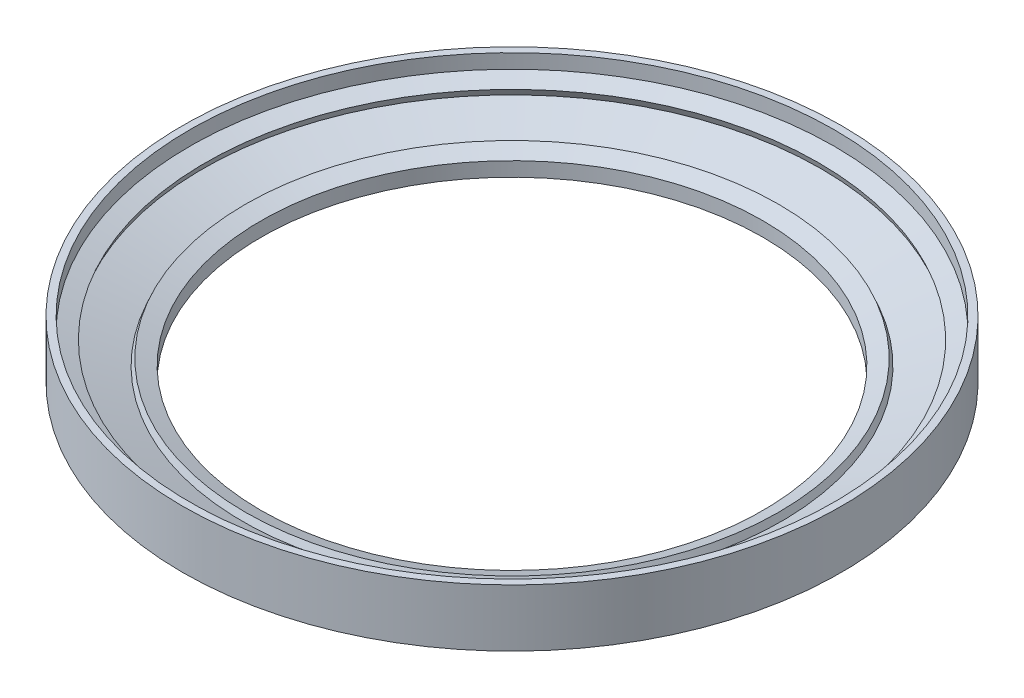
ISO-10303-21;
HEADER;
FILE_DESCRIPTION(('STEP AP214'),'2;1');
FILE_NAME('part.step','',(''),(''),'','','');
FILE_SCHEMA(('AUTOMOTIVE_DESIGN { 1 0 10303 214 1 1 1 1 }'));
ENDSEC;
DATA;
#1=APPLICATION_CONTEXT('core data for automotive mechanical design processes');
#2=APPLICATION_PROTOCOL_DEFINITION('international standard','automotive_design',2000,#1);
#3=PRODUCT_CONTEXT('',#1,'mechanical');
#4=PRODUCT('Part','Part','',(#3));
#5=PRODUCT_RELATED_PRODUCT_CATEGORY('part','',(#4));
#6=PRODUCT_DEFINITION_FORMATION('','',#4);
#7=PRODUCT_DEFINITION_CONTEXT('part definition',#1,'design');
#8=PRODUCT_DEFINITION('design','',#6,#7);
#9=PRODUCT_DEFINITION_SHAPE('','',#8);
#10=(LENGTH_UNIT() NAMED_UNIT(*) SI_UNIT(.MILLI.,.METRE.));
#11=(NAMED_UNIT(*) PLANE_ANGLE_UNIT() SI_UNIT($,.RADIAN.));
#12=(NAMED_UNIT(*) SI_UNIT($,.STERADIAN.) SOLID_ANGLE_UNIT());
#13=UNCERTAINTY_MEASURE_WITH_UNIT(LENGTH_MEASURE(1.E-05),#10,'distance_accuracy_value','');
#14=(GEOMETRIC_REPRESENTATION_CONTEXT(3) GLOBAL_UNCERTAINTY_ASSIGNED_CONTEXT((#13)) GLOBAL_UNIT_ASSIGNED_CONTEXT((#10,
#11,#12)) REPRESENTATION_CONTEXT('',''));
#15=CARTESIAN_POINT('',(0.,0.,0.));
#16=DIRECTION('',(0.,0.,1.));
#17=DIRECTION('',(1.,0.,0.));
#18=AXIS2_PLACEMENT_3D('',#15,#16,#17);
#19=CARTESIAN_POINT('',(-45.9614077649859,0.,0.));
#20=DIRECTION('',(0.,1.,0.));
#21=DIRECTION('',(0.,0.,1.));
#22=AXIS2_PLACEMENT_3D('',#19,#20,#21);
#23=PLANE('',#22);
#24=CARTESIAN_POINT('',(0.,0.,0.));
#25=DIRECTION('',(0.,-1.,0.));
#26=DIRECTION('',(0.,0.,-1.));
#27=AXIS2_PLACEMENT_3D('',#24,#25,#26);
#28=CIRCLE('',#27,35.);
#29=CARTESIAN_POINT('',(0.,0.,-35.));
#30=VERTEX_POINT('',#29);
#31=EDGE_CURVE('E64',#30,#30,#28,.T.);
#32=ORIENTED_EDGE('',*,*,#31,.F.);
#33=EDGE_LOOP('',(#32));
#34=FACE_BOUND('',#33,.T.);
#35=CARTESIAN_POINT('',(0.,0.,0.));
#36=DIRECTION('',(0.,-1.,0.));
#37=DIRECTION('',(0.,0.,-1.));
#38=AXIS2_PLACEMENT_3D('',#35,#36,#37);
#39=CIRCLE('',#38,45.9614077649859);
#40=CARTESIAN_POINT('',(0.,0.,-45.9614077649859));
#41=VERTEX_POINT('',#40);
#42=EDGE_CURVE('E10',#41,#41,#39,.T.);
#43=ORIENTED_EDGE('',*,*,#42,.T.);
#44=EDGE_LOOP('',(#43));
#45=FACE_BOUND('',#44,.T.);
#46=ADVANCED_FACE('F30',(#34,#45),#23,.F.);
#47=CARTESIAN_POINT('',(0.,0.,0.));
#48=DIRECTION('',(0.,-1.,0.));
#49=DIRECTION('',(0.,0.,-1.));
#50=AXIS2_PLACEMENT_3D('',#47,#48,#49);
#51=CYLINDRICAL_SURFACE('',#50,45.9614077649859);
#52=ORIENTED_EDGE('',*,*,#42,.F.);
#53=EDGE_LOOP('',(#52));
#54=FACE_BOUND('',#53,.T.);
#55=CARTESIAN_POINT('',(0.,8.,0.));
#56=DIRECTION('',(0.,-1.,0.));
#57=DIRECTION('',(0.,0.,-1.));
#58=AXIS2_PLACEMENT_3D('',#55,#56,#57);
#59=CIRCLE('',#58,45.9614077649859);
#60=CARTESIAN_POINT('',(0.,8.,-45.9614077649859));
#61=VERTEX_POINT('',#60);
#62=EDGE_CURVE('E36',#61,#61,#59,.T.);
#63=ORIENTED_EDGE('',*,*,#62,.T.);
#64=EDGE_LOOP('',(#63));
#65=FACE_BOUND('',#64,.T.);
#66=ADVANCED_FACE('F71',(#54,#65),#51,.T.);
#67=CARTESIAN_POINT('',(-45.9614077649859,8.,0.));
#68=DIRECTION('',(0.,-1.,0.));
#69=DIRECTION('',(0.,0.,-1.));
#70=AXIS2_PLACEMENT_3D('',#67,#68,#69);
#71=PLANE('',#70);
#72=ORIENTED_EDGE('',*,*,#62,.F.);
#73=EDGE_LOOP('',(#72));
#74=FACE_BOUND('',#73,.T.);
#75=CARTESIAN_POINT('',(0.,8.,0.));
#76=DIRECTION('',(0.,-1.,0.));
#77=DIRECTION('',(0.,0.,-1.));
#78=AXIS2_PLACEMENT_3D('',#75,#76,#77);
#79=CIRCLE('',#78,44.9614077649859);
#80=CARTESIAN_POINT('',(0.,8.,-44.9614077649859));
#81=VERTEX_POINT('',#80);
#82=EDGE_CURVE('E40',#81,#81,#79,.T.);
#83=ORIENTED_EDGE('',*,*,#82,.T.);
#84=EDGE_LOOP('',(#83));
#85=FACE_BOUND('',#84,.T.);
#86=ADVANCED_FACE('F75',(#74,#85),#71,.F.);
#87=CARTESIAN_POINT('',(0.,0.,0.));
#88=DIRECTION('',(0.,-1.,0.));
#89=DIRECTION('',(0.,0.,-1.));
#90=AXIS2_PLACEMENT_3D('',#87,#88,#89);
#91=CYLINDRICAL_SURFACE('',#90,44.9614077649859);
#92=ORIENTED_EDGE('',*,*,#82,.F.);
#93=EDGE_LOOP('',(#92));
#94=FACE_BOUND('',#93,.T.);
#95=CARTESIAN_POINT('',(0.,6.,0.));
#96=DIRECTION('',(0.,-1.,0.));
#97=DIRECTION('',(0.,0.,-1.));
#98=AXIS2_PLACEMENT_3D('',#95,#96,#97);
#99=CIRCLE('',#98,44.9614077649859);
#100=CARTESIAN_POINT('',(0.,6.,-44.9614077649859));
#101=VERTEX_POINT('',#100);
#102=EDGE_CURVE('E44',#101,#101,#99,.T.);
#103=ORIENTED_EDGE('',*,*,#102,.T.);
#104=EDGE_LOOP('',(#103));
#105=FACE_BOUND('',#104,.T.);
#106=ADVANCED_FACE('F80',(#94,#105),#91,.F.);
#107=CARTESIAN_POINT('',(0.,5.11789016347869,0.));
#108=DIRECTION('',(0.,1.,0.));
#109=DIRECTION('',(0.,0.,1.));
#110=AXIS2_PLACEMENT_3D('',#107,#108,#109);
#111=CONICAL_SURFACE('',#110,42.7646438212125,1.18895474162259);
#112=ORIENTED_EDGE('',*,*,#102,.F.);
#113=EDGE_LOOP('',(#112));
#114=FACE_BOUND('',#113,.T.);
#115=CARTESIAN_POINT('',(0.,5.11789016347869,0.));
#116=DIRECTION('',(0.,-1.,0.));
#117=DIRECTION('',(0.,0.,-1.));
#118=AXIS2_PLACEMENT_3D('',#115,#116,#117);
#119=CIRCLE('',#118,42.7646438212125);
#120=CARTESIAN_POINT('',(0.,5.11789016347869,-42.7646438212125));
#121=VERTEX_POINT('',#120);
#122=EDGE_CURVE('E49',#121,#121,#119,.T.);
#123=ORIENTED_EDGE('',*,*,#122,.T.);
#124=EDGE_LOOP('',(#123));
#125=FACE_BOUND('',#124,.T.);
#126=ADVANCED_FACE('F86',(#114,#125),#111,.F.);
#127=CARTESIAN_POINT('',(0.,4.18991018390552,0.));
#128=DIRECTION('',(0.,-1.,0.));
#129=DIRECTION('',(0.,0.,-1.));
#130=AXIS2_PLACEMENT_3D('',#127,#128,#129);
#131=CONICAL_SURFACE('',#130,43.1372738757054,0.38184158517231);
#132=ORIENTED_EDGE('',*,*,#122,.F.);
#133=EDGE_LOOP('',(#132));
#134=FACE_BOUND('',#133,.T.);
#135=CARTESIAN_POINT('',(0.,4.18991018390552,0.));
#136=DIRECTION('',(0.,-1.,0.));
#137=DIRECTION('',(0.,0.,-1.));
#138=AXIS2_PLACEMENT_3D('',#135,#136,#137);
#139=CIRCLE('',#138,43.1372738757054);
#140=CARTESIAN_POINT('',(0.,4.18991018390552,-43.1372738757054));
#141=VERTEX_POINT('',#140);
#142=EDGE_CURVE('E52',#141,#141,#139,.T.);
#143=ORIENTED_EDGE('',*,*,#142,.T.);
#144=EDGE_LOOP('',(#143));
#145=FACE_BOUND('',#144,.T.);
#146=ADVANCED_FACE('F90',(#134,#145),#131,.F.);
#147=CARTESIAN_POINT('',(0.,1.95412985694813,0.));
#148=DIRECTION('',(0.,1.,0.));
#149=DIRECTION('',(0.,0.,1.));
#150=AXIS2_PLACEMENT_3D('',#147,#148,#149);
#151=CONICAL_SURFACE('',#150,37.5693939982663,1.18895474162259);
#152=ORIENTED_EDGE('',*,*,#142,.F.);
#153=EDGE_LOOP('',(#152));
#154=FACE_BOUND('',#153,.T.);
#155=CARTESIAN_POINT('',(0.,1.95412985694813,0.));
#156=DIRECTION('',(0.,-1.,0.));
#157=DIRECTION('',(0.,0.,-1.));
#158=AXIS2_PLACEMENT_3D('',#155,#156,#157);
#159=CIRCLE('',#158,37.5693939982663);
#160=CARTESIAN_POINT('',(0.,1.95412985694813,-37.5693939982663));
#161=VERTEX_POINT('',#160);
#162=EDGE_CURVE('E55',#161,#161,#159,.T.);
#163=ORIENTED_EDGE('',*,*,#162,.T.);
#164=EDGE_LOOP('',(#163));
#165=FACE_BOUND('',#164,.T.);
#166=ADVANCED_FACE('F94',(#154,#165),#151,.F.);
#167=CARTESIAN_POINT('',(0.,2.8821098365213,0.));
#168=DIRECTION('',(0.,-1.,0.));
#169=DIRECTION('',(0.,0.,-1.));
#170=AXIS2_PLACEMENT_3D('',#167,#168,#169);
#171=CONICAL_SURFACE('',#170,37.1967639437734,0.381841585172305);
#172=ORIENTED_EDGE('',*,*,#162,.F.);
#173=EDGE_LOOP('',(#172));
#174=FACE_BOUND('',#173,.T.);
#175=CARTESIAN_POINT('',(0.,2.8821098365213,0.));
#176=DIRECTION('',(0.,-1.,0.));
#177=DIRECTION('',(0.,0.,-1.));
#178=AXIS2_PLACEMENT_3D('',#175,#176,#177);
#179=CIRCLE('',#178,37.1967639437734);
#180=CARTESIAN_POINT('',(0.,2.8821098365213,-37.1967639437734));
#181=VERTEX_POINT('',#180);
#182=EDGE_CURVE('E58',#181,#181,#179,.T.);
#183=ORIENTED_EDGE('',*,*,#182,.T.);
#184=EDGE_LOOP('',(#183));
#185=FACE_BOUND('',#184,.T.);
#186=ADVANCED_FACE('F98',(#174,#185),#171,.T.);
#187=CARTESIAN_POINT('',(0.,2.,0.));
#188=DIRECTION('',(0.,1.,0.));
#189=DIRECTION('',(0.,0.,1.));
#190=AXIS2_PLACEMENT_3D('',#187,#188,#189);
#191=CONICAL_SURFACE('',#190,35.,1.18895474162259);
#192=ORIENTED_EDGE('',*,*,#182,.F.);
#193=EDGE_LOOP('',(#192));
#194=FACE_BOUND('',#193,.T.);
#195=CARTESIAN_POINT('',(0.,2.,0.));
#196=DIRECTION('',(0.,-1.,0.));
#197=DIRECTION('',(0.,0.,-1.));
#198=AXIS2_PLACEMENT_3D('',#195,#196,#197);
#199=CIRCLE('',#198,35.);
#200=CARTESIAN_POINT('',(0.,2.,-35.));
#201=VERTEX_POINT('',#200);
#202=EDGE_CURVE('E61',#201,#201,#199,.T.);
#203=ORIENTED_EDGE('',*,*,#202,.T.);
#204=EDGE_LOOP('',(#203));
#205=FACE_BOUND('',#204,.T.);
#206=ADVANCED_FACE('F102',(#194,#205),#191,.F.);
#207=CARTESIAN_POINT('',(0.,0.,0.));
#208=DIRECTION('',(0.,-1.,0.));
#209=DIRECTION('',(0.,0.,-1.));
#210=AXIS2_PLACEMENT_3D('',#207,#208,#209);
#211=CYLINDRICAL_SURFACE('',#210,35.);
#212=ORIENTED_EDGE('',*,*,#202,.F.);
#213=EDGE_LOOP('',(#212));
#214=FACE_BOUND('',#213,.T.);
#215=ORIENTED_EDGE('',*,*,#31,.T.);
#216=EDGE_LOOP('',(#215));
#217=FACE_BOUND('',#216,.T.);
#218=ADVANCED_FACE('F68',(#214,#217),#211,.F.);
#219=CLOSED_SHELL('',(#46,#66,#86,#106,#126,#146,#166,#186,#206,#218));
#220=MANIFOLD_SOLID_BREP('B2',#219);
#221=ADVANCED_BREP_SHAPE_REPRESENTATION('',(#18,#220),#14);
#222=SHAPE_DEFINITION_REPRESENTATION(#9,#221);
ENDSEC;
END-ISO-10303-21;
